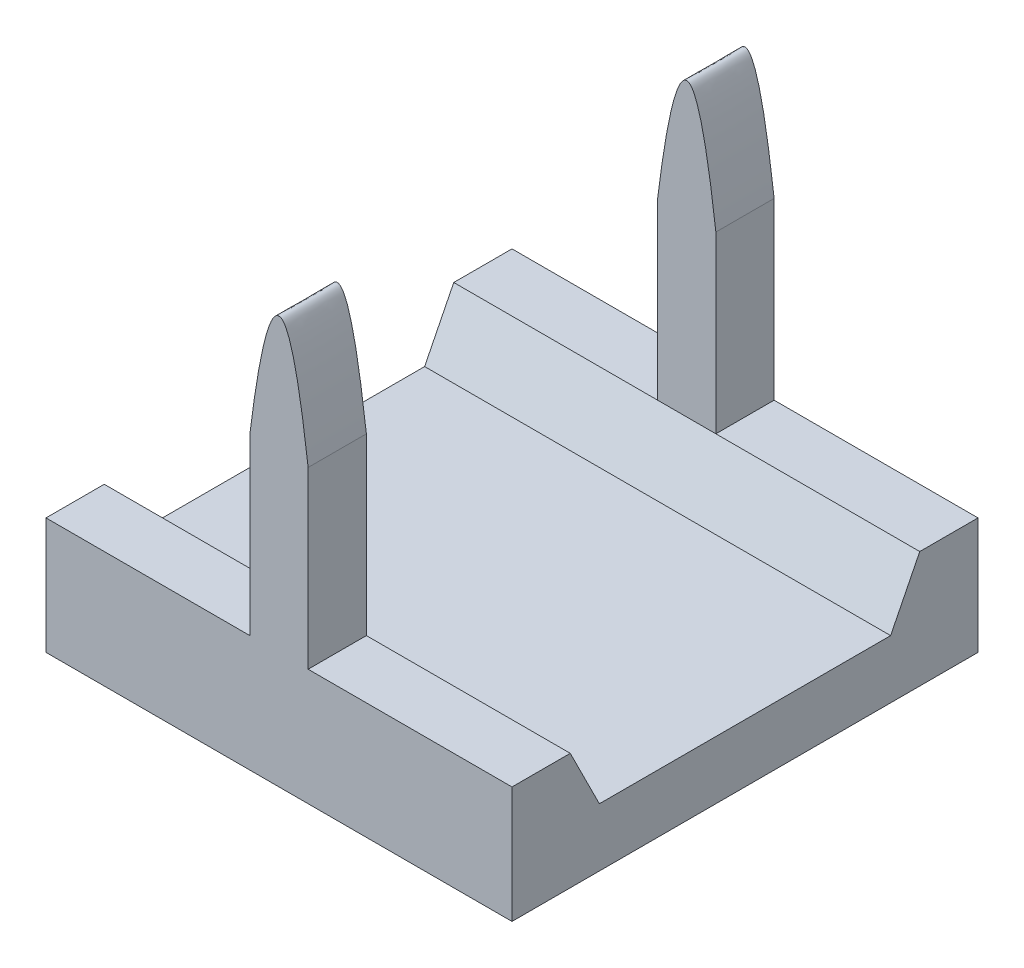
ISO-10303-21;
HEADER;
FILE_DESCRIPTION(('STEP AP214'),'2;1');
FILE_NAME('part.step','',(''),(''),'','','');
FILE_SCHEMA(('AUTOMOTIVE_DESIGN { 1 0 10303 214 1 1 1 1 }'));
ENDSEC;
DATA;
#1=APPLICATION_CONTEXT('core data for automotive mechanical design processes');
#2=APPLICATION_PROTOCOL_DEFINITION('international standard','automotive_design',2000,#1);
#3=PRODUCT_CONTEXT('',#1,'mechanical');
#4=PRODUCT('Part','Part','',(#3));
#5=PRODUCT_RELATED_PRODUCT_CATEGORY('part','',(#4));
#6=PRODUCT_DEFINITION_FORMATION('','',#4);
#7=PRODUCT_DEFINITION_CONTEXT('part definition',#1,'design');
#8=PRODUCT_DEFINITION('design','',#6,#7);
#9=PRODUCT_DEFINITION_SHAPE('','',#8);
#10=(LENGTH_UNIT() NAMED_UNIT(*) SI_UNIT(.MILLI.,.METRE.));
#11=(NAMED_UNIT(*) PLANE_ANGLE_UNIT() SI_UNIT($,.RADIAN.));
#12=(NAMED_UNIT(*) SI_UNIT($,.STERADIAN.) SOLID_ANGLE_UNIT());
#13=UNCERTAINTY_MEASURE_WITH_UNIT(LENGTH_MEASURE(1.E-05),#10,'distance_accuracy_value','');
#14=(GEOMETRIC_REPRESENTATION_CONTEXT(3) GLOBAL_UNCERTAINTY_ASSIGNED_CONTEXT((#13)) GLOBAL_UNIT_ASSIGNED_CONTEXT((#10,
#11,#12)) REPRESENTATION_CONTEXT('',''));
#15=CARTESIAN_POINT('',(0.,0.,0.));
#16=DIRECTION('',(0.,0.,1.));
#17=DIRECTION('',(1.,0.,0.));
#18=AXIS2_PLACEMENT_3D('',#15,#16,#17);
#19=CARTESIAN_POINT('',(0.,20.,0.));
#20=DIRECTION('',(0.,-1.,0.));
#21=DIRECTION('',(0.,0.,-1.));
#22=AXIS2_PLACEMENT_3D('',#19,#20,#21);
#23=PLANE('',#22);
#24=DIRECTION('',(0.,0.,-1.));
#25=VECTOR('',#24,1.);
#26=CARTESIAN_POINT('',(80.,20.,0.));
#27=LINE('',#26,#25);
#28=CARTESIAN_POINT('',(80.,20.,0.));
#29=VERTEX_POINT('',#28);
#30=CARTESIAN_POINT('',(80.,20.,-10.));
#31=VERTEX_POINT('',#30);
#32=EDGE_CURVE('E154',#29,#31,#27,.T.);
#33=ORIENTED_EDGE('',*,*,#32,.T.);
#34=DIRECTION('',(-1.,0.,0.));
#35=VECTOR('',#34,1.);
#36=CARTESIAN_POINT('',(290.051683695626,20.,-10.));
#37=LINE('',#36,#35);
#38=CARTESIAN_POINT('',(45.,20.,-10.));
#39=VERTEX_POINT('',#38);
#40=EDGE_CURVE('E282',#31,#39,#37,.T.);
#41=ORIENTED_EDGE('',*,*,#40,.T.);
#42=DIRECTION('',(0.,0.,1.));
#43=VECTOR('',#42,1.);
#44=CARTESIAN_POINT('',(45.,20.,-10.));
#45=LINE('',#44,#43);
#46=CARTESIAN_POINT('',(45.,20.,0.));
#47=VERTEX_POINT('',#46);
#48=EDGE_CURVE('E206',#39,#47,#45,.T.);
#49=ORIENTED_EDGE('',*,*,#48,.T.);
#50=DIRECTION('',(1.,0.,0.));
#51=VECTOR('',#50,1.);
#52=CARTESIAN_POINT('',(0.,20.,0.));
#53=LINE('',#52,#51);
#54=EDGE_CURVE('E202',#47,#29,#53,.T.);
#55=ORIENTED_EDGE('',*,*,#54,.T.);
#56=EDGE_LOOP('',(#33,#41,#49,#55));
#57=FACE_BOUND('',#56,.T.);
#58=ADVANCED_FACE('F33',(#57),#23,.F.);
#59=DIRECTION('',(-1.,0.,0.));
#60=VECTOR('',#59,1.);
#61=CARTESIAN_POINT('',(290.051683695626,20.,-70.));
#62=LINE('',#61,#60);
#63=CARTESIAN_POINT('',(80.,20.,-70.));
#64=VERTEX_POINT('',#63);
#65=CARTESIAN_POINT('',(45.,20.,-70.));
#66=VERTEX_POINT('',#65);
#67=EDGE_CURVE('E158',#64,#66,#62,.T.);
#68=ORIENTED_EDGE('',*,*,#67,.F.);
#69=CARTESIAN_POINT('',(80.,20.,-80.));
#70=VERTEX_POINT('',#69);
#71=EDGE_CURVE('E144',#64,#70,#27,.T.);
#72=ORIENTED_EDGE('',*,*,#71,.T.);
#73=DIRECTION('',(-1.,0.,0.));
#74=VECTOR('',#73,1.);
#75=CARTESIAN_POINT('',(0.,20.,-80.));
#76=LINE('',#75,#74);
#77=CARTESIAN_POINT('',(45.,20.,-80.));
#78=VERTEX_POINT('',#77);
#79=EDGE_CURVE('E185',#70,#78,#76,.T.);
#80=ORIENTED_EDGE('',*,*,#79,.T.);
#81=DIRECTION('',(0.,0.,-1.));
#82=VECTOR('',#81,1.);
#83=CARTESIAN_POINT('',(45.,20.,-70.));
#84=LINE('',#83,#82);
#85=EDGE_CURVE('E161',#66,#78,#84,.T.);
#86=ORIENTED_EDGE('',*,*,#85,.F.);
#87=EDGE_LOOP('',(#68,#72,#80,#86));
#88=FACE_BOUND('',#87,.T.);
#89=ADVANCED_FACE('F159',(#88),#23,.F.);
#90=CARTESIAN_POINT('',(35.,20.,-70.));
#91=VERTEX_POINT('',#90);
#92=CARTESIAN_POINT('',(0.,20.,-70.));
#93=VERTEX_POINT('',#92);
#94=EDGE_CURVE('E166',#91,#93,#62,.T.);
#95=ORIENTED_EDGE('',*,*,#94,.F.);
#96=DIRECTION('',(0.,0.,-1.));
#97=VECTOR('',#96,1.);
#98=CARTESIAN_POINT('',(35.,20.,-70.));
#99=LINE('',#98,#97);
#100=CARTESIAN_POINT('',(35.,20.,-80.));
#101=VERTEX_POINT('',#100);
#102=EDGE_CURVE('E350',#91,#101,#99,.T.);
#103=ORIENTED_EDGE('',*,*,#102,.T.);
#104=CARTESIAN_POINT('',(0.,20.,-80.));
#105=VERTEX_POINT('',#104);
#106=EDGE_CURVE('E197',#101,#105,#76,.T.);
#107=ORIENTED_EDGE('',*,*,#106,.T.);
#108=DIRECTION('',(0.,0.,1.));
#109=VECTOR('',#108,1.);
#110=CARTESIAN_POINT('',(0.,20.,0.));
#111=LINE('',#110,#109);
#112=EDGE_CURVE('E203',#105,#93,#111,.T.);
#113=ORIENTED_EDGE('',*,*,#112,.T.);
#114=EDGE_LOOP('',(#95,#103,#107,#113));
#115=FACE_BOUND('',#114,.T.);
#116=ADVANCED_FACE('F261',(#115),#23,.F.);
#117=CARTESIAN_POINT('',(0.,20.,0.));
#118=DIRECTION('',(1.,0.,0.));
#119=DIRECTION('',(0.,0.,-1.));
#120=AXIS2_PLACEMENT_3D('',#117,#118,#119);
#121=PLANE('',#120);
#122=DIRECTION('',(0.,0.894427190999916,0.447213595499958));
#123=VECTOR('',#122,1.);
#124=CARTESIAN_POINT('',(0.,24.,-8.));
#125=LINE('',#124,#123);
#126=CARTESIAN_POINT('',(0.,10.,-15.));
#127=VERTEX_POINT('',#126);
#128=CARTESIAN_POINT('',(0.,20.,-10.));
#129=VERTEX_POINT('',#128);
#130=EDGE_CURVE('E48',#127,#129,#125,.T.);
#131=ORIENTED_EDGE('',*,*,#130,.F.);
#132=DIRECTION('',(0.,0.,1.));
#133=VECTOR('',#132,1.);
#134=CARTESIAN_POINT('',(0.,10.,0.));
#135=LINE('',#134,#133);
#136=CARTESIAN_POINT('',(0.,10.,-65.));
#137=VERTEX_POINT('',#136);
#138=EDGE_CURVE('E52',#137,#127,#135,.T.);
#139=ORIENTED_EDGE('',*,*,#138,.F.);
#140=DIRECTION('',(0.,-0.894427190999916,0.447213595499958));
#141=VECTOR('',#140,1.);
#142=CARTESIAN_POINT('',(0.,-8.00000000000002,-56.));
#143=LINE('',#142,#141);
#144=EDGE_CURVE('E292',#93,#137,#143,.T.);
#145=ORIENTED_EDGE('',*,*,#144,.F.);
#146=ORIENTED_EDGE('',*,*,#112,.F.);
#147=DIRECTION('',(0.,-1.,0.));
#148=VECTOR('',#147,1.);
#149=CARTESIAN_POINT('',(0.,20.,-80.));
#150=LINE('',#149,#148);
#151=CARTESIAN_POINT('',(0.,0.,-80.));
#152=VERTEX_POINT('',#151);
#153=EDGE_CURVE('E182',#105,#152,#150,.T.);
#154=ORIENTED_EDGE('',*,*,#153,.T.);
#155=DIRECTION('',(0.,0.,1.));
#156=VECTOR('',#155,1.);
#157=CARTESIAN_POINT('',(0.,0.,0.));
#158=LINE('',#157,#156);
#159=CARTESIAN_POINT('',(0.,0.,0.));
#160=VERTEX_POINT('',#159);
#161=EDGE_CURVE('E193',#152,#160,#158,.T.);
#162=ORIENTED_EDGE('',*,*,#161,.T.);
#163=DIRECTION('',(0.,-1.,0.));
#164=VECTOR('',#163,1.);
#165=CARTESIAN_POINT('',(0.,20.,0.));
#166=LINE('',#165,#164);
#167=CARTESIAN_POINT('',(0.,20.,0.));
#168=VERTEX_POINT('',#167);
#169=EDGE_CURVE('E173',#168,#160,#166,.T.);
#170=ORIENTED_EDGE('',*,*,#169,.F.);
#171=EDGE_CURVE('E188',#129,#168,#111,.T.);
#172=ORIENTED_EDGE('',*,*,#171,.F.);
#173=EDGE_LOOP('',(#131,#139,#145,#146,#154,#162,#170,#172));
#174=FACE_BOUND('',#173,.T.);
#175=ADVANCED_FACE('F35',(#174),#121,.F.);
#176=CARTESIAN_POINT('',(80.,20.,0.));
#177=DIRECTION('',(-1.,0.,0.));
#178=DIRECTION('',(0.,0.,1.));
#179=AXIS2_PLACEMENT_3D('',#176,#177,#178);
#180=PLANE('',#179);
#181=DIRECTION('',(0.,-0.894427190999916,-0.447213595499958));
#182=VECTOR('',#181,1.);
#183=CARTESIAN_POINT('',(80.,24.,-8.));
#184=LINE('',#183,#182);
#185=CARTESIAN_POINT('',(80.,10.,-15.));
#186=VERTEX_POINT('',#185);
#187=EDGE_CURVE('E11',#31,#186,#184,.T.);
#188=ORIENTED_EDGE('',*,*,#187,.F.);
#189=ORIENTED_EDGE('',*,*,#32,.F.);
#190=DIRECTION('',(0.,-1.,0.));
#191=VECTOR('',#190,1.);
#192=CARTESIAN_POINT('',(80.,20.,0.));
#193=LINE('',#192,#191);
#194=CARTESIAN_POINT('',(80.,0.,0.));
#195=VERTEX_POINT('',#194);
#196=EDGE_CURVE('E176',#29,#195,#193,.T.);
#197=ORIENTED_EDGE('',*,*,#196,.T.);
#198=DIRECTION('',(0.,0.,-1.));
#199=VECTOR('',#198,1.);
#200=CARTESIAN_POINT('',(80.,0.,0.));
#201=LINE('',#200,#199);
#202=CARTESIAN_POINT('',(80.,0.,-80.));
#203=VERTEX_POINT('',#202);
#204=EDGE_CURVE('E189',#195,#203,#201,.T.);
#205=ORIENTED_EDGE('',*,*,#204,.T.);
#206=DIRECTION('',(0.,-1.,0.));
#207=VECTOR('',#206,1.);
#208=CARTESIAN_POINT('',(80.,20.,-80.));
#209=LINE('',#208,#207);
#210=EDGE_CURVE('E151',#70,#203,#209,.T.);
#211=ORIENTED_EDGE('',*,*,#210,.F.);
#212=ORIENTED_EDGE('',*,*,#71,.F.);
#213=DIRECTION('',(0.,0.894427190999916,-0.447213595499958));
#214=VECTOR('',#213,1.);
#215=CARTESIAN_POINT('',(80.,-8.00000000000002,-56.));
#216=LINE('',#215,#214);
#217=CARTESIAN_POINT('',(80.,10.,-65.));
#218=VERTEX_POINT('',#217);
#219=EDGE_CURVE('E148',#218,#64,#216,.T.);
#220=ORIENTED_EDGE('',*,*,#219,.F.);
#221=DIRECTION('',(0.,0.,-1.));
#222=VECTOR('',#221,1.);
#223=CARTESIAN_POINT('',(80.,10.,0.));
#224=LINE('',#223,#222);
#225=EDGE_CURVE('E41',#186,#218,#224,.T.);
#226=ORIENTED_EDGE('',*,*,#225,.F.);
#227=EDGE_LOOP('',(#188,#189,#197,#205,#211,#212,#220,#226));
#228=FACE_BOUND('',#227,.T.);
#229=ADVANCED_FACE('F146',(#228),#180,.F.);
#230=DIRECTION('',(0.,0.,1.));
#231=VECTOR('',#230,1.);
#232=CARTESIAN_POINT('',(35.,20.,-10.));
#233=LINE('',#232,#231);
#234=CARTESIAN_POINT('',(35.,20.,-10.));
#235=VERTEX_POINT('',#234);
#236=CARTESIAN_POINT('',(35.,20.,0.));
#237=VERTEX_POINT('',#236);
#238=EDGE_CURVE('E196',#235,#237,#233,.T.);
#239=ORIENTED_EDGE('',*,*,#238,.F.);
#240=EDGE_CURVE('E293',#235,#129,#37,.T.);
#241=ORIENTED_EDGE('',*,*,#240,.T.);
#242=ORIENTED_EDGE('',*,*,#171,.T.);
#243=EDGE_CURVE('E155',#168,#237,#53,.T.);
#244=ORIENTED_EDGE('',*,*,#243,.T.);
#245=EDGE_LOOP('',(#239,#241,#242,#244));
#246=FACE_BOUND('',#245,.T.);
#247=ADVANCED_FACE('F256',(#246),#23,.F.);
#248=CARTESIAN_POINT('',(0.,20.,0.));
#249=DIRECTION('',(0.,0.,-1.));
#250=DIRECTION('',(-1.,0.,0.));
#251=AXIS2_PLACEMENT_3D('',#248,#249,#250);
#252=PLANE('',#251);
#253=DIRECTION('',(1.,0.,0.));
#254=VECTOR('',#253,1.);
#255=CARTESIAN_POINT('',(0.,0.,0.));
#256=LINE('',#255,#254);
#257=EDGE_CURVE('E191',#160,#195,#256,.T.);
#258=ORIENTED_EDGE('',*,*,#257,.T.);
#259=ORIENTED_EDGE('',*,*,#196,.F.);
#260=ORIENTED_EDGE('',*,*,#54,.F.);
#261=DIRECTION('',(0.,1.,0.));
#262=VECTOR('',#261,1.);
#263=CARTESIAN_POINT('',(45.,20.,0.));
#264=LINE('',#263,#262);
#265=CARTESIAN_POINT('',(45.,50.,0.));
#266=VERTEX_POINT('',#265);
#267=EDGE_CURVE('E224',#47,#266,#264,.T.);
#268=ORIENTED_EDGE('',*,*,#267,.T.);
#269=CARTESIAN_POINT('',(45.,50.,0.));
#270=CARTESIAN_POINT('',(40.,90.,0.));
#271=CARTESIAN_POINT('',(35.,50.,0.));
#272=B_SPLINE_CURVE_WITH_KNOTS('',2,(#269,#270,#271),.UNSPECIFIED.,.F.,.F.,(3,3),(0.,1.),.UNSPECIFIED.);
#273=CARTESIAN_POINT('',(35.,50.,0.));
#274=VERTEX_POINT('',#273);
#275=EDGE_CURVE('E219',#266,#274,#272,.T.);
#276=ORIENTED_EDGE('',*,*,#275,.T.);
#277=DIRECTION('',(0.,-1.,0.));
#278=VECTOR('',#277,1.);
#279=CARTESIAN_POINT('',(35.,20.,0.));
#280=LINE('',#279,#278);
#281=EDGE_CURVE('E215',#274,#237,#280,.T.);
#282=ORIENTED_EDGE('',*,*,#281,.T.);
#283=ORIENTED_EDGE('',*,*,#243,.F.);
#284=ORIENTED_EDGE('',*,*,#169,.T.);
#285=EDGE_LOOP('',(#258,#259,#260,#268,#276,#282,#283,#284));
#286=FACE_BOUND('',#285,.T.);
#287=ADVANCED_FACE('F259',(#286),#252,.F.);
#288=CARTESIAN_POINT('',(0.,20.,-80.));
#289=DIRECTION('',(0.,0.,1.));
#290=DIRECTION('',(1.,0.,0.));
#291=AXIS2_PLACEMENT_3D('',#288,#289,#290);
#292=PLANE('',#291);
#293=DIRECTION('',(-1.,0.,0.));
#294=VECTOR('',#293,1.);
#295=CARTESIAN_POINT('',(0.,0.,-80.));
#296=LINE('',#295,#294);
#297=EDGE_CURVE('E186',#203,#152,#296,.T.);
#298=ORIENTED_EDGE('',*,*,#297,.T.);
#299=ORIENTED_EDGE('',*,*,#153,.F.);
#300=ORIENTED_EDGE('',*,*,#106,.F.);
#301=DIRECTION('',(0.,-1.,0.));
#302=VECTOR('',#301,1.);
#303=CARTESIAN_POINT('',(35.,20.,-80.));
#304=LINE('',#303,#302);
#305=CARTESIAN_POINT('',(35.,50.,-80.));
#306=VERTEX_POINT('',#305);
#307=EDGE_CURVE('E301',#306,#101,#304,.T.);
#308=ORIENTED_EDGE('',*,*,#307,.F.);
#309=CARTESIAN_POINT('',(45.,50.,-80.));
#310=CARTESIAN_POINT('',(40.,90.,-80.));
#311=CARTESIAN_POINT('',(35.,50.,-80.));
#312=B_SPLINE_CURVE_WITH_KNOTS('',2,(#309,#310,#311),.UNSPECIFIED.,.F.,.F.,(3,3),(0.,1.),.UNSPECIFIED.);
#313=CARTESIAN_POINT('',(45.,50.,-80.));
#314=VERTEX_POINT('',#313);
#315=EDGE_CURVE('E368',#314,#306,#312,.T.);
#316=ORIENTED_EDGE('',*,*,#315,.F.);
#317=DIRECTION('',(0.,1.,0.));
#318=VECTOR('',#317,1.);
#319=CARTESIAN_POINT('',(45.,20.,-80.));
#320=LINE('',#319,#318);
#321=EDGE_CURVE('E306',#78,#314,#320,.T.);
#322=ORIENTED_EDGE('',*,*,#321,.F.);
#323=ORIENTED_EDGE('',*,*,#79,.F.);
#324=ORIENTED_EDGE('',*,*,#210,.T.);
#325=EDGE_LOOP('',(#298,#299,#300,#308,#316,#322,#323,#324));
#326=FACE_BOUND('',#325,.T.);
#327=ADVANCED_FACE('F265',(#326),#292,.F.);
#328=CARTESIAN_POINT('',(0.,0.,0.));
#329=DIRECTION('',(0.,-1.,0.));
#330=DIRECTION('',(0.,0.,-1.));
#331=AXIS2_PLACEMENT_3D('',#328,#329,#330);
#332=PLANE('',#331);
#333=ORIENTED_EDGE('',*,*,#161,.F.);
#334=ORIENTED_EDGE('',*,*,#297,.F.);
#335=ORIENTED_EDGE('',*,*,#204,.F.);
#336=ORIENTED_EDGE('',*,*,#257,.F.);
#337=EDGE_LOOP('',(#333,#334,#335,#336));
#338=FACE_BOUND('',#337,.T.);
#339=ADVANCED_FACE('F262',(#338),#332,.T.);
#340=CARTESIAN_POINT('',(35.,20.,-10.));
#341=DIRECTION('',(-1.,0.,0.));
#342=DIRECTION('',(0.,0.,1.));
#343=AXIS2_PLACEMENT_3D('',#340,#341,#342);
#344=PLANE('',#343);
#345=ORIENTED_EDGE('',*,*,#281,.F.);
#346=DIRECTION('',(0.,0.,1.));
#347=VECTOR('',#346,1.);
#348=CARTESIAN_POINT('',(35.,50.,-10.));
#349=LINE('',#348,#347);
#350=CARTESIAN_POINT('',(35.,50.,-10.));
#351=VERTEX_POINT('',#350);
#352=EDGE_CURVE('E212',#351,#274,#349,.T.);
#353=ORIENTED_EDGE('',*,*,#352,.F.);
#354=DIRECTION('',(0.,-1.,0.));
#355=VECTOR('',#354,1.);
#356=CARTESIAN_POINT('',(35.,20.,-10.));
#357=LINE('',#356,#355);
#358=EDGE_CURVE('E210',#351,#235,#357,.T.);
#359=ORIENTED_EDGE('',*,*,#358,.T.);
#360=ORIENTED_EDGE('',*,*,#238,.T.);
#361=EDGE_LOOP('',(#345,#353,#359,#360));
#362=FACE_BOUND('',#361,.T.);
#363=ADVANCED_FACE('F249',(#362),#344,.T.);
#364=CARTESIAN_POINT('',(45.,50.,-10.));
#365=CARTESIAN_POINT('',(40.,90.,-10.));
#366=CARTESIAN_POINT('',(35.,50.,-10.));
#367=B_SPLINE_CURVE_WITH_KNOTS('',2,(#364,#365,#366),.UNSPECIFIED.,.F.,.F.,(3,3),(0.,1.),.UNSPECIFIED.);
#368=DIRECTION('',(0.,0.,1.));
#369=VECTOR('',#368,1.);
#370=SURFACE_OF_LINEAR_EXTRUSION('',#367,#369);
#371=ORIENTED_EDGE('',*,*,#275,.F.);
#372=DIRECTION('',(0.,0.,1.));
#373=VECTOR('',#372,1.);
#374=CARTESIAN_POINT('',(45.,50.,-10.));
#375=LINE('',#374,#373);
#376=CARTESIAN_POINT('',(45.,50.,-10.));
#377=VERTEX_POINT('',#376);
#378=EDGE_CURVE('E209',#377,#266,#375,.T.);
#379=ORIENTED_EDGE('',*,*,#378,.F.);
#380=EDGE_CURVE('E232',#377,#351,#367,.T.);
#381=ORIENTED_EDGE('',*,*,#380,.T.);
#382=ORIENTED_EDGE('',*,*,#352,.T.);
#383=EDGE_LOOP('',(#371,#379,#381,#382));
#384=FACE_BOUND('',#383,.T.);
#385=ADVANCED_FACE('F244',(#384),#370,.T.);
#386=CARTESIAN_POINT('',(45.,20.,-10.));
#387=DIRECTION('',(1.,0.,0.));
#388=DIRECTION('',(0.,0.,-1.));
#389=AXIS2_PLACEMENT_3D('',#386,#387,#388);
#390=PLANE('',#389);
#391=ORIENTED_EDGE('',*,*,#267,.F.);
#392=ORIENTED_EDGE('',*,*,#48,.F.);
#393=DIRECTION('',(0.,1.,0.));
#394=VECTOR('',#393,1.);
#395=CARTESIAN_POINT('',(45.,20.,-10.));
#396=LINE('',#395,#394);
#397=EDGE_CURVE('E238',#39,#377,#396,.T.);
#398=ORIENTED_EDGE('',*,*,#397,.T.);
#399=ORIENTED_EDGE('',*,*,#378,.T.);
#400=EDGE_LOOP('',(#391,#392,#398,#399));
#401=FACE_BOUND('',#400,.T.);
#402=ADVANCED_FACE('F248',(#401),#390,.T.);
#403=CARTESIAN_POINT('',(40.,70.,-10.));
#404=DIRECTION('',(0.,0.,1.));
#405=DIRECTION('',(1.,0.,0.));
#406=AXIS2_PLACEMENT_3D('',#403,#404,#405);
#407=PLANE('',#406);
#408=DIRECTION('',(1.,0.,0.));
#409=VECTOR('',#408,1.);
#410=CARTESIAN_POINT('',(35.,20.,-10.));
#411=LINE('',#410,#409);
#412=EDGE_CURVE('E218',#235,#39,#411,.T.);
#413=ORIENTED_EDGE('',*,*,#412,.F.);
#414=ORIENTED_EDGE('',*,*,#358,.F.);
#415=ORIENTED_EDGE('',*,*,#380,.F.);
#416=ORIENTED_EDGE('',*,*,#397,.F.);
#417=EDGE_LOOP('',(#413,#414,#415,#416));
#418=FACE_BOUND('',#417,.T.);
#419=ADVANCED_FACE('F254',(#418),#407,.F.);
#420=CARTESIAN_POINT('',(45.,20.,-70.));
#421=DIRECTION('',(-1.,0.,0.));
#422=DIRECTION('',(0.,0.,1.));
#423=AXIS2_PLACEMENT_3D('',#420,#421,#422);
#424=PLANE('',#423);
#425=ORIENTED_EDGE('',*,*,#321,.T.);
#426=DIRECTION('',(0.,0.,-1.));
#427=VECTOR('',#426,1.);
#428=CARTESIAN_POINT('',(45.,50.,-70.));
#429=LINE('',#428,#427);
#430=CARTESIAN_POINT('',(45.,50.,-70.));
#431=VERTEX_POINT('',#430);
#432=EDGE_CURVE('E361',#431,#314,#429,.T.);
#433=ORIENTED_EDGE('',*,*,#432,.F.);
#434=DIRECTION('',(0.,1.,0.));
#435=VECTOR('',#434,1.);
#436=CARTESIAN_POINT('',(45.,20.,-70.));
#437=LINE('',#436,#435);
#438=EDGE_CURVE('E314',#66,#431,#437,.T.);
#439=ORIENTED_EDGE('',*,*,#438,.F.);
#440=ORIENTED_EDGE('',*,*,#85,.T.);
#441=EDGE_LOOP('',(#425,#433,#439,#440));
#442=FACE_BOUND('',#441,.T.);
#443=ADVANCED_FACE('F325',(#442),#424,.F.);
#444=CARTESIAN_POINT('',(45.,50.,-70.));
#445=CARTESIAN_POINT('',(40.,90.,-70.));
#446=CARTESIAN_POINT('',(35.,50.,-70.));
#447=B_SPLINE_CURVE_WITH_KNOTS('',2,(#444,#445,#446),.UNSPECIFIED.,.F.,.F.,(3,3),(0.,1.),.UNSPECIFIED.);
#448=DIRECTION('',(0.,0.,-1.));
#449=VECTOR('',#448,1.);
#450=SURFACE_OF_LINEAR_EXTRUSION('',#447,#449);
#451=ORIENTED_EDGE('',*,*,#315,.T.);
#452=DIRECTION('',(0.,0.,-1.));
#453=VECTOR('',#452,1.);
#454=CARTESIAN_POINT('',(35.,50.,-70.));
#455=LINE('',#454,#453);
#456=CARTESIAN_POINT('',(35.,50.,-70.));
#457=VERTEX_POINT('',#456);
#458=EDGE_CURVE('E359',#457,#306,#455,.T.);
#459=ORIENTED_EDGE('',*,*,#458,.F.);
#460=EDGE_CURVE('E309',#431,#457,#447,.T.);
#461=ORIENTED_EDGE('',*,*,#460,.F.);
#462=ORIENTED_EDGE('',*,*,#432,.T.);
#463=EDGE_LOOP('',(#451,#459,#461,#462));
#464=FACE_BOUND('',#463,.T.);
#465=ADVANCED_FACE('F320',(#464),#450,.F.);
#466=CARTESIAN_POINT('',(35.,20.,-70.));
#467=DIRECTION('',(1.,0.,0.));
#468=DIRECTION('',(0.,0.,-1.));
#469=AXIS2_PLACEMENT_3D('',#466,#467,#468);
#470=PLANE('',#469);
#471=ORIENTED_EDGE('',*,*,#307,.T.);
#472=ORIENTED_EDGE('',*,*,#102,.F.);
#473=DIRECTION('',(0.,-1.,0.));
#474=VECTOR('',#473,1.);
#475=CARTESIAN_POINT('',(35.,20.,-70.));
#476=LINE('',#475,#474);
#477=EDGE_CURVE('E305',#457,#91,#476,.T.);
#478=ORIENTED_EDGE('',*,*,#477,.F.);
#479=ORIENTED_EDGE('',*,*,#458,.T.);
#480=EDGE_LOOP('',(#471,#472,#478,#479));
#481=FACE_BOUND('',#480,.T.);
#482=ADVANCED_FACE('F324',(#481),#470,.F.);
#483=CARTESIAN_POINT('',(40.,70.,-70.));
#484=DIRECTION('',(0.,0.,-1.));
#485=DIRECTION('',(1.,0.,0.));
#486=AXIS2_PLACEMENT_3D('',#483,#484,#485);
#487=PLANE('',#486);
#488=DIRECTION('',(1.,0.,0.));
#489=VECTOR('',#488,1.);
#490=CARTESIAN_POINT('',(35.,20.,-70.));
#491=LINE('',#490,#489);
#492=EDGE_CURVE('E302',#91,#66,#491,.T.);
#493=ORIENTED_EDGE('',*,*,#492,.T.);
#494=ORIENTED_EDGE('',*,*,#438,.T.);
#495=ORIENTED_EDGE('',*,*,#460,.T.);
#496=ORIENTED_EDGE('',*,*,#477,.T.);
#497=EDGE_LOOP('',(#493,#494,#495,#496));
#498=FACE_BOUND('',#497,.T.);
#499=ADVANCED_FACE('F329',(#498),#487,.F.);
#500=CARTESIAN_POINT('',(290.051683695626,20.,-10.));
#501=DIRECTION('',(0.,0.447213595499958,-0.894427190999916));
#502=DIRECTION('',(0.,0.894427190999916,0.447213595499958));
#503=AXIS2_PLACEMENT_3D('',#500,#501,#502);
#504=PLANE('',#503);
#505=DIRECTION('',(-1.,0.,0.));
#506=VECTOR('',#505,1.);
#507=CARTESIAN_POINT('',(290.051683695626,10.,-15.));
#508=LINE('',#507,#506);
#509=EDGE_CURVE('E165',#186,#127,#508,.T.);
#510=ORIENTED_EDGE('',*,*,#509,.T.);
#511=ORIENTED_EDGE('',*,*,#130,.T.);
#512=ORIENTED_EDGE('',*,*,#240,.F.);
#513=ORIENTED_EDGE('',*,*,#412,.T.);
#514=ORIENTED_EDGE('',*,*,#40,.F.);
#515=ORIENTED_EDGE('',*,*,#187,.T.);
#516=EDGE_LOOP('',(#510,#511,#512,#513,#514,#515));
#517=FACE_BOUND('',#516,.T.);
#518=ADVANCED_FACE('F289',(#517),#504,.T.);
#519=CARTESIAN_POINT('',(290.051683695626,10.,-15.));
#520=DIRECTION('',(0.,1.,0.));
#521=DIRECTION('',(0.,0.,1.));
#522=AXIS2_PLACEMENT_3D('',#519,#520,#521);
#523=PLANE('',#522);
#524=DIRECTION('',(-1.,0.,0.));
#525=VECTOR('',#524,1.);
#526=CARTESIAN_POINT('',(290.051683695626,10.,-65.));
#527=LINE('',#526,#525);
#528=EDGE_CURVE('E172',#218,#137,#527,.T.);
#529=ORIENTED_EDGE('',*,*,#528,.T.);
#530=ORIENTED_EDGE('',*,*,#138,.T.);
#531=ORIENTED_EDGE('',*,*,#509,.F.);
#532=ORIENTED_EDGE('',*,*,#225,.T.);
#533=EDGE_LOOP('',(#529,#530,#531,#532));
#534=FACE_BOUND('',#533,.T.);
#535=ADVANCED_FACE('F346',(#534),#523,.T.);
#536=CARTESIAN_POINT('',(290.051683695626,10.,-65.));
#537=DIRECTION('',(0.,0.447213595499958,0.894427190999916));
#538=DIRECTION('',(0.,-0.894427190999916,0.447213595499958));
#539=AXIS2_PLACEMENT_3D('',#536,#537,#538);
#540=PLANE('',#539);
#541=ORIENTED_EDGE('',*,*,#94,.T.);
#542=ORIENTED_EDGE('',*,*,#144,.T.);
#543=ORIENTED_EDGE('',*,*,#528,.F.);
#544=ORIENTED_EDGE('',*,*,#219,.T.);
#545=ORIENTED_EDGE('',*,*,#67,.T.);
#546=ORIENTED_EDGE('',*,*,#492,.F.);
#547=EDGE_LOOP('',(#541,#542,#543,#544,#545,#546));
#548=FACE_BOUND('',#547,.T.);
#549=ADVANCED_FACE('F170',(#548),#540,.T.);
#550=CLOSED_SHELL('',(#58,#89,#116,#175,#229,#247,#287,#327,#339,#363,#385,#402,#419,#443,#465,
#482,#499,#518,#535,#549));
#551=MANIFOLD_SOLID_BREP('B2',#550);
#552=ADVANCED_BREP_SHAPE_REPRESENTATION('',(#18,#551),#14);
#553=SHAPE_DEFINITION_REPRESENTATION(#9,#552);
ENDSEC;
END-ISO-10303-21;
